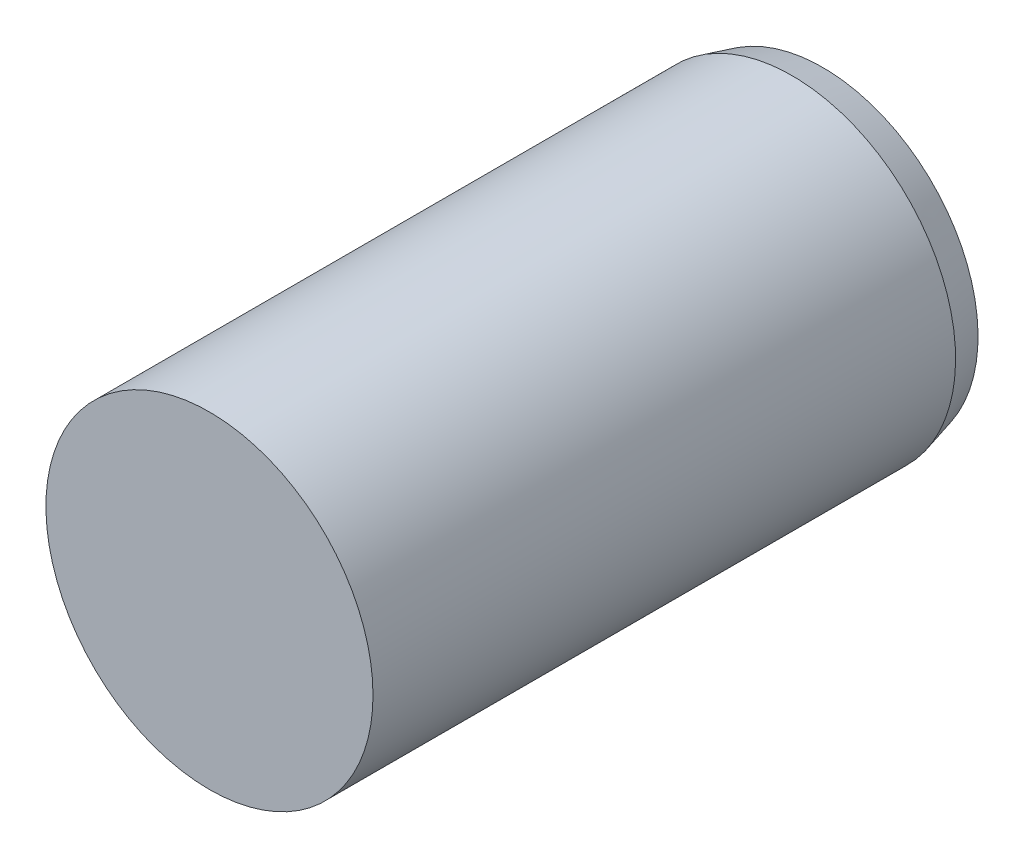
ISO-10303-21;
HEADER;
FILE_DESCRIPTION(('STEP AP214'),'2;1');
FILE_NAME('part.step','',(''),(''),'','','');
FILE_SCHEMA(('AUTOMOTIVE_DESIGN { 1 0 10303 214 1 1 1 1 }'));
ENDSEC;
DATA;
#1=APPLICATION_CONTEXT('core data for automotive mechanical design processes');
#2=APPLICATION_PROTOCOL_DEFINITION('international standard','automotive_design',2000,#1);
#3=PRODUCT_CONTEXT('',#1,'mechanical');
#4=PRODUCT('Part','Part','',(#3));
#5=PRODUCT_RELATED_PRODUCT_CATEGORY('part','',(#4));
#6=PRODUCT_DEFINITION_FORMATION('','',#4);
#7=PRODUCT_DEFINITION_CONTEXT('part definition',#1,'design');
#8=PRODUCT_DEFINITION('design','',#6,#7);
#9=PRODUCT_DEFINITION_SHAPE('','',#8);
#10=(LENGTH_UNIT() NAMED_UNIT(*) SI_UNIT(.MILLI.,.METRE.));
#11=(NAMED_UNIT(*) PLANE_ANGLE_UNIT() SI_UNIT($,.RADIAN.));
#12=(NAMED_UNIT(*) SI_UNIT($,.STERADIAN.) SOLID_ANGLE_UNIT());
#13=UNCERTAINTY_MEASURE_WITH_UNIT(LENGTH_MEASURE(1.E-05),#10,'distance_accuracy_value','');
#14=(GEOMETRIC_REPRESENTATION_CONTEXT(3) GLOBAL_UNCERTAINTY_ASSIGNED_CONTEXT((#13)) GLOBAL_UNIT_ASSIGNED_CONTEXT((#10,
#11,#12)) REPRESENTATION_CONTEXT('',''));
#15=CARTESIAN_POINT('',(0.,0.,0.));
#16=DIRECTION('',(0.,0.,1.));
#17=DIRECTION('',(1.,0.,0.));
#18=AXIS2_PLACEMENT_3D('',#15,#16,#17);
#19=CARTESIAN_POINT('',(0.,0.,6.35));
#20=DIRECTION('',(0.,0.,1.));
#21=DIRECTION('',(0.,-1.,0.));
#22=AXIS2_PLACEMENT_3D('',#19,#20,#21);
#23=CYLINDRICAL_SURFACE('',#22,3.175);
#24=CARTESIAN_POINT('',(0.,0.,5.55625));
#25=DIRECTION('',(0.,0.,1.));
#26=DIRECTION('',(1.,0.,0.));
#27=AXIS2_PLACEMENT_3D('',#24,#25,#26);
#28=CIRCLE('',#27,3.175);
#29=CARTESIAN_POINT('',(3.175,0.,5.55625));
#30=VERTEX_POINT('',#29);
#31=EDGE_CURVE('E53',#30,#30,#28,.T.);
#32=ORIENTED_EDGE('',*,*,#31,.F.);
#33=EDGE_LOOP('',(#32));
#34=FACE_BOUND('',#33,.T.);
#35=CARTESIAN_POINT('',(0.,0.,-5.7546875));
#36=DIRECTION('',(0.,0.,1.));
#37=DIRECTION('',(0.,-1.,0.));
#38=AXIS2_PLACEMENT_3D('',#35,#36,#37);
#39=CIRCLE('',#38,3.175);
#40=CARTESIAN_POINT('',(0.,-3.175,-5.7546875));
#41=VERTEX_POINT('',#40);
#42=EDGE_CURVE('E10',#41,#41,#39,.T.);
#43=ORIENTED_EDGE('',*,*,#42,.T.);
#44=EDGE_LOOP('',(#43));
#45=FACE_BOUND('',#44,.T.);
#46=ADVANCED_FACE('F40',(#34,#45),#23,.T.);
#47=CARTESIAN_POINT('',(0.,0.,-6.35));
#48=DIRECTION('',(0.,0.,1.));
#49=DIRECTION('',(0.,-1.,0.));
#50=AXIS2_PLACEMENT_3D('',#47,#48,#49);
#51=CONICAL_SURFACE('',#50,3.01548649638085,0.261799387799142);
#52=ORIENTED_EDGE('',*,*,#42,.F.);
#53=EDGE_LOOP('',(#52));
#54=FACE_BOUND('',#53,.T.);
#55=CARTESIAN_POINT('',(0.,0.,-6.35));
#56=DIRECTION('',(0.,0.,1.));
#57=DIRECTION('',(0.,-1.,0.));
#58=AXIS2_PLACEMENT_3D('',#55,#56,#57);
#59=CIRCLE('',#58,3.01548649638085);
#60=CARTESIAN_POINT('',(0.,-3.01548649638085,-6.35));
#61=VERTEX_POINT('',#60);
#62=EDGE_CURVE('E47',#61,#61,#59,.T.);
#63=ORIENTED_EDGE('',*,*,#62,.T.);
#64=EDGE_LOOP('',(#63));
#65=FACE_BOUND('',#64,.T.);
#66=ADVANCED_FACE('F66',(#54,#65),#51,.T.);
#67=CARTESIAN_POINT('',(0.,0.,-6.35));
#68=DIRECTION('',(0.,0.,1.));
#69=DIRECTION('',(0.,-1.,0.));
#70=AXIS2_PLACEMENT_3D('',#67,#68,#69);
#71=PLANE('',#70);
#72=ORIENTED_EDGE('',*,*,#62,.F.);
#73=EDGE_LOOP('',(#72));
#74=FACE_BOUND('',#73,.T.);
#75=ADVANCED_FACE('F70',(#74),#71,.F.);
#76=CARTESIAN_POINT('',(0.,0.,5.55625));
#77=DIRECTION('',(0.,0.,1.));
#78=DIRECTION('',(1.,0.,0.));
#79=AXIS2_PLACEMENT_3D('',#76,#77,#78);
#80=PLANE('',#79);
#81=ORIENTED_EDGE('',*,*,#31,.T.);
#82=EDGE_LOOP('',(#81));
#83=FACE_BOUND('',#82,.T.);
#84=ADVANCED_FACE('F63',(#83),#80,.T.);
#85=CLOSED_SHELL('',(#46,#66,#75,#84));
#86=MANIFOLD_SOLID_BREP('B2',#85);
#87=ADVANCED_BREP_SHAPE_REPRESENTATION('',(#18,#86),#14);
#88=SHAPE_DEFINITION_REPRESENTATION(#9,#87);
ENDSEC;
END-ISO-10303-21;
